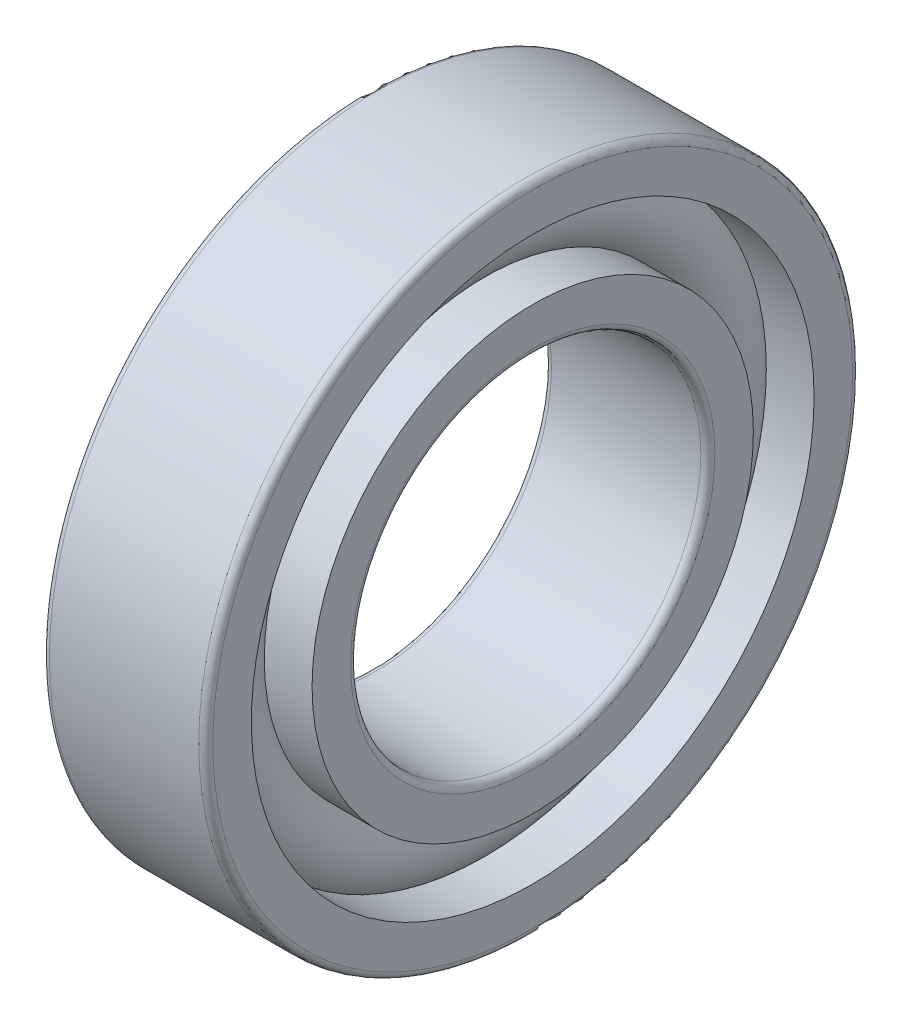
ISO-10303-21;
HEADER;
FILE_DESCRIPTION(('STEP AP214'),'2;1');
FILE_NAME('part.step','',(''),(''),'','','');
FILE_SCHEMA(('AUTOMOTIVE_DESIGN { 1 0 10303 214 1 1 1 1 }'));
ENDSEC;
DATA;
#1=APPLICATION_CONTEXT('core data for automotive mechanical design processes');
#2=APPLICATION_PROTOCOL_DEFINITION('international standard','automotive_design',2000,#1);
#3=PRODUCT_CONTEXT('',#1,'mechanical');
#4=PRODUCT('Part','Part','',(#3));
#5=PRODUCT_RELATED_PRODUCT_CATEGORY('part','',(#4));
#6=PRODUCT_DEFINITION_FORMATION('','',#4);
#7=PRODUCT_DEFINITION_CONTEXT('part definition',#1,'design');
#8=PRODUCT_DEFINITION('design','',#6,#7);
#9=PRODUCT_DEFINITION_SHAPE('','',#8);
#10=(LENGTH_UNIT() NAMED_UNIT(*) SI_UNIT(.MILLI.,.METRE.));
#11=(NAMED_UNIT(*) PLANE_ANGLE_UNIT() SI_UNIT($,.RADIAN.));
#12=(NAMED_UNIT(*) SI_UNIT($,.STERADIAN.) SOLID_ANGLE_UNIT());
#13=UNCERTAINTY_MEASURE_WITH_UNIT(LENGTH_MEASURE(1.E-05),#10,'distance_accuracy_value','');
#14=(GEOMETRIC_REPRESENTATION_CONTEXT(3) GLOBAL_UNCERTAINTY_ASSIGNED_CONTEXT((#13)) GLOBAL_UNIT_ASSIGNED_CONTEXT((#10,
#11,#12)) REPRESENTATION_CONTEXT('',''));
#15=CARTESIAN_POINT('',(0.,0.,0.));
#16=DIRECTION('',(0.,0.,1.));
#17=DIRECTION('',(1.,0.,0.));
#18=AXIS2_PLACEMENT_3D('',#15,#16,#17);
#19=CARTESIAN_POINT('',(0.,0.,0.));
#20=DIRECTION('',(-1.,0.,0.));
#21=DIRECTION('',(0.,0.,1.));
#22=AXIS2_PLACEMENT_3D('',#19,#20,#21);
#23=TOROIDAL_SURFACE('',#22,10.75,1.95);
#24=CARTESIAN_POINT('',(1.45344418537486,0.,0.));
#25=DIRECTION('',(-1.,0.,0.));
#26=DIRECTION('',(0.,0.,1.));
#27=AXIS2_PLACEMENT_3D('',#24,#25,#26);
#28=CIRCLE('',#27,12.05);
#29=CARTESIAN_POINT('',(1.45344418537486,0.,12.05));
#30=VERTEX_POINT('',#29);
#31=EDGE_CURVE('E36',#30,#30,#28,.F.);
#32=ORIENTED_EDGE('',*,*,#31,.T.);
#33=EDGE_LOOP('',(#32));
#34=FACE_BOUND('',#33,.T.);
#35=CARTESIAN_POINT('',(1.45344418537486,0.,0.));
#36=DIRECTION('',(-1.,0.,0.));
#37=DIRECTION('',(0.,0.,1.));
#38=AXIS2_PLACEMENT_3D('',#35,#36,#37);
#39=CIRCLE('',#38,9.45);
#40=CARTESIAN_POINT('',(1.45344418537486,0.,9.45));
#41=VERTEX_POINT('',#40);
#42=EDGE_CURVE('E10',#41,#41,#39,.T.);
#43=ORIENTED_EDGE('',*,*,#42,.T.);
#44=EDGE_LOOP('',(#43));
#45=FACE_BOUND('',#44,.T.);
#46=ADVANCED_FACE('F32',(#34,#45),#23,.T.);
#47=CARTESIAN_POINT('',(-20.6375,0.,0.));
#48=DIRECTION('',(1.,0.,0.));
#49=DIRECTION('',(0.,0.,-1.));
#50=AXIS2_PLACEMENT_3D('',#47,#48,#49);
#51=CYLINDRICAL_SURFACE('',#50,9.45);
#52=CARTESIAN_POINT('',(3.5,0.,0.));
#53=DIRECTION('',(1.,0.,0.));
#54=DIRECTION('',(0.,0.,-1.));
#55=AXIS2_PLACEMENT_3D('',#52,#53,#54);
#56=CIRCLE('',#55,9.45);
#57=CARTESIAN_POINT('',(3.5,0.,-9.45));
#58=VERTEX_POINT('',#57);
#59=EDGE_CURVE('E45',#58,#58,#56,.T.);
#60=ORIENTED_EDGE('',*,*,#59,.F.);
#61=EDGE_LOOP('',(#60));
#62=FACE_BOUND('',#61,.T.);
#63=ORIENTED_EDGE('',*,*,#42,.F.);
#64=EDGE_LOOP('',(#63));
#65=FACE_BOUND('',#64,.T.);
#66=ADVANCED_FACE('F84',(#62,#65),#51,.T.);
#67=CARTESIAN_POINT('',(-20.6375,0.,0.));
#68=DIRECTION('',(1.,0.,0.));
#69=DIRECTION('',(0.,0.,-1.));
#70=AXIS2_PLACEMENT_3D('',#67,#68,#69);
#71=CYLINDRICAL_SURFACE('',#70,9.45);
#72=CARTESIAN_POINT('',(-3.5,0.,0.));
#73=DIRECTION('',(1.,0.,0.));
#74=DIRECTION('',(0.,0.,-1.));
#75=AXIS2_PLACEMENT_3D('',#72,#73,#74);
#76=CIRCLE('',#75,9.45);
#77=CARTESIAN_POINT('',(-3.5,0.,-9.45));
#78=VERTEX_POINT('',#77);
#79=EDGE_CURVE('E54',#78,#78,#76,.T.);
#80=ORIENTED_EDGE('',*,*,#79,.T.);
#81=EDGE_LOOP('',(#80));
#82=FACE_BOUND('',#81,.T.);
#83=CARTESIAN_POINT('',(-1.45344418537486,0.,0.));
#84=DIRECTION('',(1.,0.,0.));
#85=DIRECTION('',(0.,0.,-1.));
#86=AXIS2_PLACEMENT_3D('',#83,#84,#85);
#87=CIRCLE('',#86,9.45);
#88=CARTESIAN_POINT('',(-1.45344418537486,0.,-9.45));
#89=VERTEX_POINT('',#88);
#90=EDGE_CURVE('E40',#89,#89,#87,.T.);
#91=ORIENTED_EDGE('',*,*,#90,.F.);
#92=EDGE_LOOP('',(#91));
#93=FACE_BOUND('',#92,.T.);
#94=ADVANCED_FACE('F87',(#82,#93),#71,.T.);
#95=CARTESIAN_POINT('',(3.5,7.8,0.));
#96=DIRECTION('',(1.,0.,0.));
#97=DIRECTION('',(0.,0.,-1.));
#98=AXIS2_PLACEMENT_3D('',#95,#96,#97);
#99=PLANE('',#98);
#100=ORIENTED_EDGE('',*,*,#59,.T.);
#101=EDGE_LOOP('',(#100));
#102=FACE_BOUND('',#101,.T.);
#103=CARTESIAN_POINT('',(3.5,0.,0.));
#104=DIRECTION('',(1.,0.,0.));
#105=DIRECTION('',(0.,0.,-1.));
#106=AXIS2_PLACEMENT_3D('',#103,#104,#105);
#107=CIRCLE('',#106,7.8);
#108=CARTESIAN_POINT('',(3.5,0.,-7.8));
#109=VERTEX_POINT('',#108);
#110=EDGE_CURVE('E76',#109,#109,#107,.T.);
#111=ORIENTED_EDGE('',*,*,#110,.F.);
#112=EDGE_LOOP('',(#111));
#113=FACE_BOUND('',#112,.T.);
#114=ADVANCED_FACE('F81',(#102,#113),#99,.T.);
#115=CARTESIAN_POINT('',(3.2,0.,0.));
#116=DIRECTION('',(1.,0.,0.));
#117=DIRECTION('',(0.,0.,-1.));
#118=AXIS2_PLACEMENT_3D('',#115,#116,#117);
#119=TOROIDAL_SURFACE('',#118,7.8,0.3);
#120=ORIENTED_EDGE('',*,*,#110,.T.);
#121=EDGE_LOOP('',(#120));
#122=FACE_BOUND('',#121,.T.);
#123=CARTESIAN_POINT('',(3.2,0.,0.));
#124=DIRECTION('',(1.,0.,0.));
#125=DIRECTION('',(0.,0.,-1.));
#126=AXIS2_PLACEMENT_3D('',#123,#124,#125);
#127=CIRCLE('',#126,7.5);
#128=CARTESIAN_POINT('',(3.2,0.,-7.5));
#129=VERTEX_POINT('',#128);
#130=EDGE_CURVE('E73',#129,#129,#127,.T.);
#131=ORIENTED_EDGE('',*,*,#130,.F.);
#132=EDGE_LOOP('',(#131));
#133=FACE_BOUND('',#132,.T.);
#134=ADVANCED_FACE('F98',(#122,#133),#119,.T.);
#135=CARTESIAN_POINT('',(-20.6375,0.,0.));
#136=DIRECTION('',(1.,0.,0.));
#137=DIRECTION('',(0.,0.,-1.));
#138=AXIS2_PLACEMENT_3D('',#135,#136,#137);
#139=CYLINDRICAL_SURFACE('',#138,7.5);
#140=ORIENTED_EDGE('',*,*,#130,.T.);
#141=EDGE_LOOP('',(#140));
#142=FACE_BOUND('',#141,.T.);
#143=CARTESIAN_POINT('',(-3.2,0.,0.));
#144=DIRECTION('',(1.,0.,0.));
#145=DIRECTION('',(0.,0.,-1.));
#146=AXIS2_PLACEMENT_3D('',#143,#144,#145);
#147=CIRCLE('',#146,7.5);
#148=CARTESIAN_POINT('',(-3.2,0.,-7.5));
#149=VERTEX_POINT('',#148);
#150=EDGE_CURVE('E70',#149,#149,#147,.T.);
#151=ORIENTED_EDGE('',*,*,#150,.F.);
#152=EDGE_LOOP('',(#151));
#153=FACE_BOUND('',#152,.T.);
#154=ADVANCED_FACE('F101',(#142,#153),#139,.F.);
#155=CARTESIAN_POINT('',(-3.2,0.,0.));
#156=DIRECTION('',(1.,0.,0.));
#157=DIRECTION('',(0.,0.,-1.));
#158=AXIS2_PLACEMENT_3D('',#155,#156,#157);
#159=TOROIDAL_SURFACE('',#158,7.8,0.3);
#160=ORIENTED_EDGE('',*,*,#150,.T.);
#161=EDGE_LOOP('',(#160));
#162=FACE_BOUND('',#161,.T.);
#163=CARTESIAN_POINT('',(-3.5,0.,0.));
#164=DIRECTION('',(1.,0.,0.));
#165=DIRECTION('',(0.,0.,-1.));
#166=AXIS2_PLACEMENT_3D('',#163,#164,#165);
#167=CIRCLE('',#166,7.8);
#168=CARTESIAN_POINT('',(-3.5,0.,-7.8));
#169=VERTEX_POINT('',#168);
#170=EDGE_CURVE('E67',#169,#169,#167,.T.);
#171=ORIENTED_EDGE('',*,*,#170,.F.);
#172=EDGE_LOOP('',(#171));
#173=FACE_BOUND('',#172,.T.);
#174=ADVANCED_FACE('F105',(#162,#173),#159,.T.);
#175=CARTESIAN_POINT('',(-3.5,9.45,0.));
#176=DIRECTION('',(-1.,0.,0.));
#177=DIRECTION('',(0.,0.,1.));
#178=AXIS2_PLACEMENT_3D('',#175,#176,#177);
#179=PLANE('',#178);
#180=ORIENTED_EDGE('',*,*,#170,.T.);
#181=EDGE_LOOP('',(#180));
#182=FACE_BOUND('',#181,.T.);
#183=ORIENTED_EDGE('',*,*,#79,.F.);
#184=EDGE_LOOP('',(#183));
#185=FACE_BOUND('',#184,.T.);
#186=ADVANCED_FACE('F109',(#182,#185),#179,.T.);
#187=CARTESIAN_POINT('',(-1.45344418537486,0.,0.));
#188=DIRECTION('',(1.,0.,0.));
#189=DIRECTION('',(0.,0.,-1.));
#190=AXIS2_PLACEMENT_3D('',#187,#188,#189);
#191=CIRCLE('',#190,12.05);
#192=CARTESIAN_POINT('',(-1.45344418537486,0.,-12.05));
#193=VERTEX_POINT('',#192);
#194=EDGE_CURVE('E48',#193,#193,#191,.F.);
#195=ORIENTED_EDGE('',*,*,#194,.T.);
#196=EDGE_LOOP('',(#195));
#197=FACE_BOUND('',#196,.T.);
#198=ORIENTED_EDGE('',*,*,#90,.T.);
#199=EDGE_LOOP('',(#198));
#200=FACE_BOUND('',#199,.T.);
#201=ADVANCED_FACE('F34',(#197,#200),#23,.T.);
#202=CARTESIAN_POINT('',(-20.6375,0.,0.));
#203=DIRECTION('',(1.,0.,0.));
#204=DIRECTION('',(0.,0.,-1.));
#205=AXIS2_PLACEMENT_3D('',#202,#203,#204);
#206=CYLINDRICAL_SURFACE('',#205,12.05);
#207=CARTESIAN_POINT('',(3.5,0.,0.));
#208=DIRECTION('',(1.,0.,0.));
#209=DIRECTION('',(0.,0.,-1.));
#210=AXIS2_PLACEMENT_3D('',#207,#208,#209);
#211=CIRCLE('',#210,12.05);
#212=CARTESIAN_POINT('',(3.5,0.,-12.05));
#213=VERTEX_POINT('',#212);
#214=EDGE_CURVE('E50',#213,#213,#211,.T.);
#215=ORIENTED_EDGE('',*,*,#214,.T.);
#216=EDGE_LOOP('',(#215));
#217=FACE_BOUND('',#216,.T.);
#218=ORIENTED_EDGE('',*,*,#31,.F.);
#219=EDGE_LOOP('',(#218));
#220=FACE_BOUND('',#219,.T.);
#221=ADVANCED_FACE('F114',(#217,#220),#206,.F.);
#222=CARTESIAN_POINT('',(-20.6375,0.,0.));
#223=DIRECTION('',(1.,0.,0.));
#224=DIRECTION('',(0.,0.,-1.));
#225=AXIS2_PLACEMENT_3D('',#222,#223,#224);
#226=CYLINDRICAL_SURFACE('',#225,12.05);
#227=CARTESIAN_POINT('',(-3.5,0.,0.));
#228=DIRECTION('',(1.,0.,0.));
#229=DIRECTION('',(0.,0.,-1.));
#230=AXIS2_PLACEMENT_3D('',#227,#228,#229);
#231=CIRCLE('',#230,12.05);
#232=CARTESIAN_POINT('',(-3.5,0.,-12.05));
#233=VERTEX_POINT('',#232);
#234=EDGE_CURVE('E145',#233,#233,#231,.T.);
#235=ORIENTED_EDGE('',*,*,#234,.F.);
#236=EDGE_LOOP('',(#235));
#237=FACE_BOUND('',#236,.T.);
#238=ORIENTED_EDGE('',*,*,#194,.F.);
#239=EDGE_LOOP('',(#238));
#240=FACE_BOUND('',#239,.T.);
#241=ADVANCED_FACE('F117',(#237,#240),#226,.F.);
#242=CARTESIAN_POINT('',(3.5,13.7,0.));
#243=DIRECTION('',(1.,0.,0.));
#244=DIRECTION('',(0.,0.,-1.));
#245=AXIS2_PLACEMENT_3D('',#242,#243,#244);
#246=PLANE('',#245);
#247=CARTESIAN_POINT('',(3.5,0.,0.));
#248=DIRECTION('',(1.,0.,0.));
#249=DIRECTION('',(0.,0.,-1.));
#250=AXIS2_PLACEMENT_3D('',#247,#248,#249);
#251=CIRCLE('',#250,13.7);
#252=CARTESIAN_POINT('',(3.5,0.,-13.7));
#253=VERTEX_POINT('',#252);
#254=EDGE_CURVE('E56',#253,#253,#251,.T.);
#255=ORIENTED_EDGE('',*,*,#254,.T.);
#256=EDGE_LOOP('',(#255));
#257=FACE_BOUND('',#256,.T.);
#258=ORIENTED_EDGE('',*,*,#214,.F.);
#259=EDGE_LOOP('',(#258));
#260=FACE_BOUND('',#259,.T.);
#261=ADVANCED_FACE('F118',(#257,#260),#246,.T.);
#262=CARTESIAN_POINT('',(3.2,0.,0.));
#263=DIRECTION('',(1.,0.,0.));
#264=DIRECTION('',(0.,0.,-1.));
#265=AXIS2_PLACEMENT_3D('',#262,#263,#264);
#266=TOROIDAL_SURFACE('',#265,13.7,0.299999999999999);
#267=CARTESIAN_POINT('',(3.2,0.,0.));
#268=DIRECTION('',(1.,0.,0.));
#269=DIRECTION('',(0.,0.,-1.));
#270=AXIS2_PLACEMENT_3D('',#267,#268,#269);
#271=CIRCLE('',#270,14.);
#272=CARTESIAN_POINT('',(3.2,0.,-14.));
#273=VERTEX_POINT('',#272);
#274=EDGE_CURVE('E61',#273,#273,#271,.T.);
#275=ORIENTED_EDGE('',*,*,#274,.T.);
#276=EDGE_LOOP('',(#275));
#277=FACE_BOUND('',#276,.T.);
#278=ORIENTED_EDGE('',*,*,#254,.F.);
#279=EDGE_LOOP('',(#278));
#280=FACE_BOUND('',#279,.T.);
#281=ADVANCED_FACE('F121',(#277,#280),#266,.T.);
#282=CARTESIAN_POINT('',(-20.6375,0.,0.));
#283=DIRECTION('',(1.,0.,0.));
#284=DIRECTION('',(0.,0.,-1.));
#285=AXIS2_PLACEMENT_3D('',#282,#283,#284);
#286=CYLINDRICAL_SURFACE('',#285,14.);
#287=CARTESIAN_POINT('',(-3.2,0.,0.));
#288=DIRECTION('',(1.,0.,0.));
#289=DIRECTION('',(0.,0.,-1.));
#290=AXIS2_PLACEMENT_3D('',#287,#288,#289);
#291=CIRCLE('',#290,14.);
#292=CARTESIAN_POINT('',(-3.2,0.,-14.));
#293=VERTEX_POINT('',#292);
#294=EDGE_CURVE('E149',#293,#293,#291,.T.);
#295=ORIENTED_EDGE('',*,*,#294,.T.);
#296=EDGE_LOOP('',(#295));
#297=FACE_BOUND('',#296,.T.);
#298=ORIENTED_EDGE('',*,*,#274,.F.);
#299=EDGE_LOOP('',(#298));
#300=FACE_BOUND('',#299,.T.);
#301=ADVANCED_FACE('F125',(#297,#300),#286,.T.);
#302=CARTESIAN_POINT('',(-3.2,0.,0.));
#303=DIRECTION('',(1.,0.,0.));
#304=DIRECTION('',(0.,0.,-1.));
#305=AXIS2_PLACEMENT_3D('',#302,#303,#304);
#306=TOROIDAL_SURFACE('',#305,13.7,0.299999999999999);
#307=CARTESIAN_POINT('',(-3.5,0.,0.));
#308=DIRECTION('',(1.,0.,0.));
#309=DIRECTION('',(0.,0.,-1.));
#310=AXIS2_PLACEMENT_3D('',#307,#308,#309);
#311=CIRCLE('',#310,13.7);
#312=CARTESIAN_POINT('',(-3.5,0.,-13.7));
#313=VERTEX_POINT('',#312);
#314=EDGE_CURVE('E146',#313,#313,#311,.T.);
#315=ORIENTED_EDGE('',*,*,#314,.T.);
#316=EDGE_LOOP('',(#315));
#317=FACE_BOUND('',#316,.T.);
#318=ORIENTED_EDGE('',*,*,#294,.F.);
#319=EDGE_LOOP('',(#318));
#320=FACE_BOUND('',#319,.T.);
#321=ADVANCED_FACE('F129',(#317,#320),#306,.T.);
#322=CARTESIAN_POINT('',(-3.5,12.05,0.));
#323=DIRECTION('',(-1.,0.,0.));
#324=DIRECTION('',(0.,0.,1.));
#325=AXIS2_PLACEMENT_3D('',#322,#323,#324);
#326=PLANE('',#325);
#327=ORIENTED_EDGE('',*,*,#234,.T.);
#328=EDGE_LOOP('',(#327));
#329=FACE_BOUND('',#328,.T.);
#330=ORIENTED_EDGE('',*,*,#314,.F.);
#331=EDGE_LOOP('',(#330));
#332=FACE_BOUND('',#331,.T.);
#333=ADVANCED_FACE('F133',(#329,#332),#326,.T.);
#334=CLOSED_SHELL('',(#46,#66,#94,#114,#134,#154,#174,#186,#201,#221,#241,#261,#281,#301,#321,#333));
#335=MANIFOLD_SOLID_BREP('B2',#334);
#336=ADVANCED_BREP_SHAPE_REPRESENTATION('',(#18,#335),#14);
#337=SHAPE_DEFINITION_REPRESENTATION(#9,#336);
ENDSEC;
END-ISO-10303-21;
